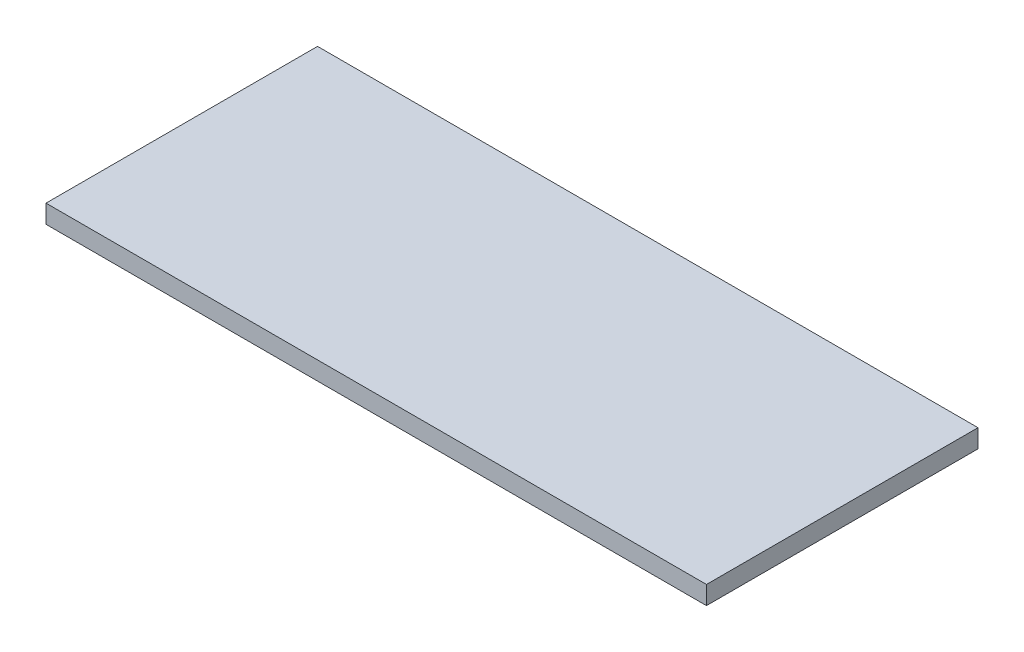
ISO-10303-21;
HEADER;
FILE_DESCRIPTION(('STEP AP214'),'2;1');
FILE_NAME('part.step','',(''),(''),'','','');
FILE_SCHEMA(('AUTOMOTIVE_DESIGN { 1 0 10303 214 1 1 1 1 }'));
ENDSEC;
DATA;
#1=APPLICATION_CONTEXT('core data for automotive mechanical design processes');
#2=APPLICATION_PROTOCOL_DEFINITION('international standard','automotive_design',2000,#1);
#3=PRODUCT_CONTEXT('',#1,'mechanical');
#4=PRODUCT('Part','Part','',(#3));
#5=PRODUCT_RELATED_PRODUCT_CATEGORY('part','',(#4));
#6=PRODUCT_DEFINITION_FORMATION('','',#4);
#7=PRODUCT_DEFINITION_CONTEXT('part definition',#1,'design');
#8=PRODUCT_DEFINITION('design','',#6,#7);
#9=PRODUCT_DEFINITION_SHAPE('','',#8);
#10=(LENGTH_UNIT() NAMED_UNIT(*) SI_UNIT(.MILLI.,.METRE.));
#11=(NAMED_UNIT(*) PLANE_ANGLE_UNIT() SI_UNIT($,.RADIAN.));
#12=(NAMED_UNIT(*) SI_UNIT($,.STERADIAN.) SOLID_ANGLE_UNIT());
#13=UNCERTAINTY_MEASURE_WITH_UNIT(LENGTH_MEASURE(1.E-05),#10,'distance_accuracy_value','');
#14=(GEOMETRIC_REPRESENTATION_CONTEXT(3) GLOBAL_UNCERTAINTY_ASSIGNED_CONTEXT((#13)) GLOBAL_UNIT_ASSIGNED_CONTEXT((#10,
#11,#12)) REPRESENTATION_CONTEXT('',''));
#15=CARTESIAN_POINT('',(0.,0.,0.));
#16=DIRECTION('',(0.,0.,1.));
#17=DIRECTION('',(1.,0.,0.));
#18=AXIS2_PLACEMENT_3D('',#15,#16,#17);
#19=CARTESIAN_POINT('',(228.6,12.7,-93.98));
#20=DIRECTION('',(-1.,0.,0.));
#21=DIRECTION('',(0.,0.,1.));
#22=AXIS2_PLACEMENT_3D('',#19,#20,#21);
#23=PLANE('',#22);
#24=DIRECTION('',(0.,0.,-1.));
#25=VECTOR('',#24,1.);
#26=CARTESIAN_POINT('',(228.6,0.,-93.98));
#27=LINE('',#26,#25);
#28=CARTESIAN_POINT('',(228.6,0.,93.98));
#29=VERTEX_POINT('',#28);
#30=CARTESIAN_POINT('',(228.6,0.,-93.98));
#31=VERTEX_POINT('',#30);
#32=EDGE_CURVE('E98',#29,#31,#27,.T.);
#33=ORIENTED_EDGE('',*,*,#32,.T.);
#34=DIRECTION('',(0.,-1.,0.));
#35=VECTOR('',#34,1.);
#36=CARTESIAN_POINT('',(228.6,12.7,-93.98));
#37=LINE('',#36,#35);
#38=CARTESIAN_POINT('',(228.6,12.7,-93.98));
#39=VERTEX_POINT('',#38);
#40=EDGE_CURVE('E11',#39,#31,#37,.T.);
#41=ORIENTED_EDGE('',*,*,#40,.F.);
#42=DIRECTION('',(0.,0.,-1.));
#43=VECTOR('',#42,1.);
#44=CARTESIAN_POINT('',(228.6,12.7,-93.98));
#45=LINE('',#44,#43);
#46=CARTESIAN_POINT('',(228.6,12.7,93.98));
#47=VERTEX_POINT('',#46);
#48=EDGE_CURVE('E86',#47,#39,#45,.T.);
#49=ORIENTED_EDGE('',*,*,#48,.F.);
#50=DIRECTION('',(0.,-1.,0.));
#51=VECTOR('',#50,1.);
#52=CARTESIAN_POINT('',(228.6,12.7,93.98));
#53=LINE('',#52,#51);
#54=EDGE_CURVE('E94',#47,#29,#53,.T.);
#55=ORIENTED_EDGE('',*,*,#54,.T.);
#56=EDGE_LOOP('',(#33,#41,#49,#55));
#57=FACE_BOUND('',#56,.T.);
#58=ADVANCED_FACE('F35',(#57),#23,.F.);
#59=CARTESIAN_POINT('',(-228.6,12.7,-93.98));
#60=DIRECTION('',(0.,0.,1.));
#61=DIRECTION('',(1.,0.,0.));
#62=AXIS2_PLACEMENT_3D('',#59,#60,#61);
#63=PLANE('',#62);
#64=DIRECTION('',(-1.,0.,0.));
#65=VECTOR('',#64,1.);
#66=CARTESIAN_POINT('',(-228.6,0.,-93.98));
#67=LINE('',#66,#65);
#68=CARTESIAN_POINT('',(-228.6,0.,-93.98));
#69=VERTEX_POINT('',#68);
#70=EDGE_CURVE('E90',#31,#69,#67,.T.);
#71=ORIENTED_EDGE('',*,*,#70,.T.);
#72=DIRECTION('',(0.,-1.,0.));
#73=VECTOR('',#72,1.);
#74=CARTESIAN_POINT('',(-228.6,12.7,-93.98));
#75=LINE('',#74,#73);
#76=CARTESIAN_POINT('',(-228.6,12.7,-93.98));
#77=VERTEX_POINT('',#76);
#78=EDGE_CURVE('E43',#77,#69,#75,.T.);
#79=ORIENTED_EDGE('',*,*,#78,.F.);
#80=DIRECTION('',(-1.,0.,0.));
#81=VECTOR('',#80,1.);
#82=CARTESIAN_POINT('',(-228.6,12.7,-93.98));
#83=LINE('',#82,#81);
#84=EDGE_CURVE('E81',#39,#77,#83,.T.);
#85=ORIENTED_EDGE('',*,*,#84,.F.);
#86=ORIENTED_EDGE('',*,*,#40,.T.);
#87=EDGE_LOOP('',(#71,#79,#85,#86));
#88=FACE_BOUND('',#87,.T.);
#89=ADVANCED_FACE('F89',(#88),#63,.F.);
#90=CARTESIAN_POINT('',(-228.6,12.7,-93.98));
#91=DIRECTION('',(1.,0.,0.));
#92=DIRECTION('',(0.,0.,-1.));
#93=AXIS2_PLACEMENT_3D('',#90,#91,#92);
#94=PLANE('',#93);
#95=DIRECTION('',(0.,0.,1.));
#96=VECTOR('',#95,1.);
#97=CARTESIAN_POINT('',(-228.6,0.,-93.98));
#98=LINE('',#97,#96);
#99=CARTESIAN_POINT('',(-228.6,0.,93.98));
#100=VERTEX_POINT('',#99);
#101=EDGE_CURVE('E68',#69,#100,#98,.T.);
#102=ORIENTED_EDGE('',*,*,#101,.T.);
#103=DIRECTION('',(0.,-1.,0.));
#104=VECTOR('',#103,1.);
#105=CARTESIAN_POINT('',(-228.6,12.7,93.98));
#106=LINE('',#105,#104);
#107=CARTESIAN_POINT('',(-228.6,12.7,93.98));
#108=VERTEX_POINT('',#107);
#109=EDGE_CURVE('E91',#108,#100,#106,.T.);
#110=ORIENTED_EDGE('',*,*,#109,.F.);
#111=DIRECTION('',(0.,0.,1.));
#112=VECTOR('',#111,1.);
#113=CARTESIAN_POINT('',(-228.6,12.7,-93.98));
#114=LINE('',#113,#112);
#115=EDGE_CURVE('E84',#77,#108,#114,.T.);
#116=ORIENTED_EDGE('',*,*,#115,.F.);
#117=ORIENTED_EDGE('',*,*,#78,.T.);
#118=EDGE_LOOP('',(#102,#110,#116,#117));
#119=FACE_BOUND('',#118,.T.);
#120=ADVANCED_FACE('F92',(#119),#94,.F.);
#121=CARTESIAN_POINT('',(-228.6,12.7,93.98));
#122=DIRECTION('',(0.,0.,-1.));
#123=DIRECTION('',(-1.,0.,0.));
#124=AXIS2_PLACEMENT_3D('',#121,#122,#123);
#125=PLANE('',#124);
#126=DIRECTION('',(1.,0.,0.));
#127=VECTOR('',#126,1.);
#128=CARTESIAN_POINT('',(-228.6,0.,93.98));
#129=LINE('',#128,#127);
#130=EDGE_CURVE('E74',#100,#29,#129,.T.);
#131=ORIENTED_EDGE('',*,*,#130,.T.);
#132=ORIENTED_EDGE('',*,*,#54,.F.);
#133=DIRECTION('',(1.,0.,0.));
#134=VECTOR('',#133,1.);
#135=CARTESIAN_POINT('',(-228.6,12.7,93.98));
#136=LINE('',#135,#134);
#137=EDGE_CURVE('E51',#108,#47,#136,.T.);
#138=ORIENTED_EDGE('',*,*,#137,.F.);
#139=ORIENTED_EDGE('',*,*,#109,.T.);
#140=EDGE_LOOP('',(#131,#132,#138,#139));
#141=FACE_BOUND('',#140,.T.);
#142=ADVANCED_FACE('F105',(#141),#125,.F.);
#143=CARTESIAN_POINT('',(0.,12.7,0.));
#144=DIRECTION('',(0.,1.,0.));
#145=DIRECTION('',(0.,0.,1.));
#146=AXIS2_PLACEMENT_3D('',#143,#144,#145);
#147=PLANE('',#146);
#148=ORIENTED_EDGE('',*,*,#48,.T.);
#149=ORIENTED_EDGE('',*,*,#84,.T.);
#150=ORIENTED_EDGE('',*,*,#115,.T.);
#151=ORIENTED_EDGE('',*,*,#137,.T.);
#152=EDGE_LOOP('',(#148,#149,#150,#151));
#153=FACE_BOUND('',#152,.T.);
#154=ADVANCED_FACE('F82',(#153),#147,.T.);
#155=CARTESIAN_POINT('',(0.,0.,0.));
#156=DIRECTION('',(0.,1.,0.));
#157=DIRECTION('',(0.,0.,1.));
#158=AXIS2_PLACEMENT_3D('',#155,#156,#157);
#159=PLANE('',#158);
#160=ORIENTED_EDGE('',*,*,#32,.F.);
#161=ORIENTED_EDGE('',*,*,#130,.F.);
#162=ORIENTED_EDGE('',*,*,#101,.F.);
#163=ORIENTED_EDGE('',*,*,#70,.F.);
#164=EDGE_LOOP('',(#160,#161,#162,#163));
#165=FACE_BOUND('',#164,.T.);
#166=ADVANCED_FACE('F108',(#165),#159,.F.);
#167=CLOSED_SHELL('',(#58,#89,#120,#142,#154,#166));
#168=MANIFOLD_SOLID_BREP('B2',#167);
#169=ADVANCED_BREP_SHAPE_REPRESENTATION('',(#18,#168),#14);
#170=SHAPE_DEFINITION_REPRESENTATION(#9,#169);
ENDSEC;
END-ISO-10303-21;
